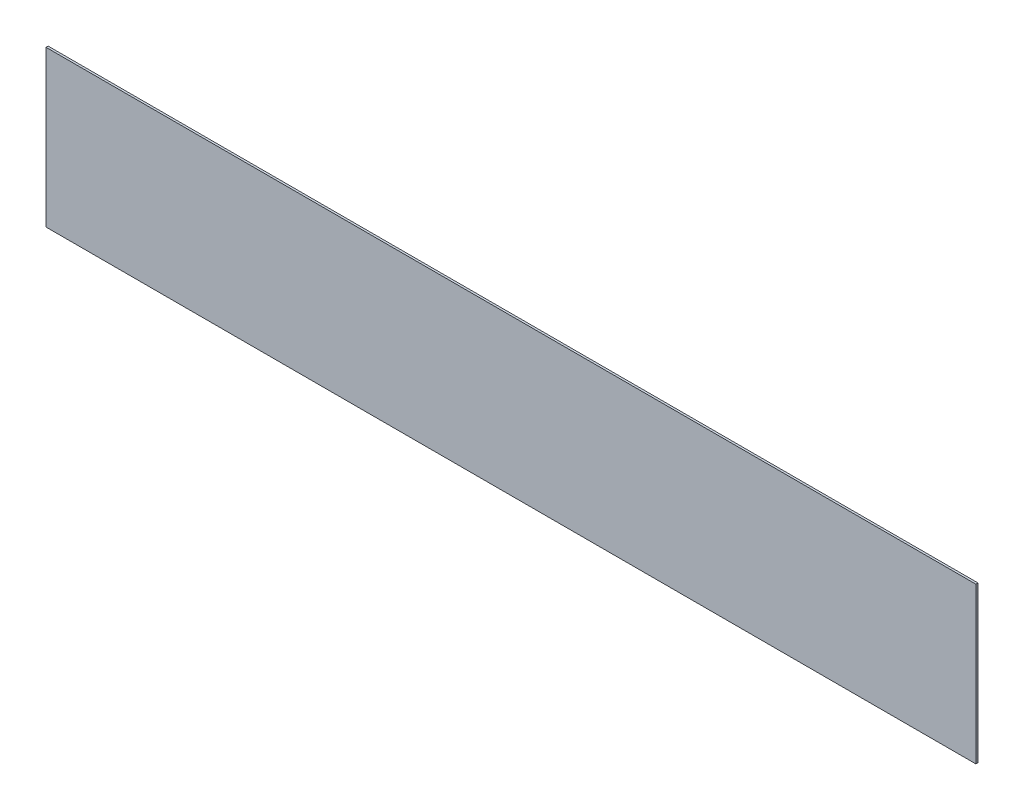
ISO-10303-21;
HEADER;
FILE_DESCRIPTION(('STEP AP214'),'2;1');
FILE_NAME('part.step','',(''),(''),'','','');
FILE_SCHEMA(('AUTOMOTIVE_DESIGN { 1 0 10303 214 1 1 1 1 }'));
ENDSEC;
DATA;
#1=APPLICATION_CONTEXT('core data for automotive mechanical design processes');
#2=APPLICATION_PROTOCOL_DEFINITION('international standard','automotive_design',2000,#1);
#3=PRODUCT_CONTEXT('',#1,'mechanical');
#4=PRODUCT('Part','Part','',(#3));
#5=PRODUCT_RELATED_PRODUCT_CATEGORY('part','',(#4));
#6=PRODUCT_DEFINITION_FORMATION('','',#4);
#7=PRODUCT_DEFINITION_CONTEXT('part definition',#1,'design');
#8=PRODUCT_DEFINITION('design','',#6,#7);
#9=PRODUCT_DEFINITION_SHAPE('','',#8);
#10=(LENGTH_UNIT() NAMED_UNIT(*) SI_UNIT(.MILLI.,.METRE.));
#11=(NAMED_UNIT(*) PLANE_ANGLE_UNIT() SI_UNIT($,.RADIAN.));
#12=(NAMED_UNIT(*) SI_UNIT($,.STERADIAN.) SOLID_ANGLE_UNIT());
#13=UNCERTAINTY_MEASURE_WITH_UNIT(LENGTH_MEASURE(1.E-05),#10,'distance_accuracy_value','');
#14=(GEOMETRIC_REPRESENTATION_CONTEXT(3) GLOBAL_UNCERTAINTY_ASSIGNED_CONTEXT((#13)) GLOBAL_UNIT_ASSIGNED_CONTEXT((#10,
#11,#12)) REPRESENTATION_CONTEXT('',''));
#15=CARTESIAN_POINT('',(0.,0.,0.));
#16=DIRECTION('',(0.,0.,1.));
#17=DIRECTION('',(1.,0.,0.));
#18=AXIS2_PLACEMENT_3D('',#15,#16,#17);
#19=CARTESIAN_POINT('',(21.5,10.,-800.));
#20=DIRECTION('',(-1.,0.,0.));
#21=DIRECTION('',(0.,0.,1.));
#22=AXIS2_PLACEMENT_3D('',#19,#20,#21);
#23=PLANE('',#22);
#24=DIRECTION('',(0.,-1.,0.));
#25=VECTOR('',#24,1.);
#26=CARTESIAN_POINT('',(21.5,10.,-798.5));
#27=LINE('',#26,#25);
#28=CARTESIAN_POINT('',(21.5,120.,-798.5));
#29=VERTEX_POINT('',#28);
#30=CARTESIAN_POINT('',(21.5,10.,-798.5));
#31=VERTEX_POINT('',#30);
#32=EDGE_CURVE('E103',#29,#31,#27,.T.);
#33=ORIENTED_EDGE('',*,*,#32,.F.);
#34=DIRECTION('',(0.,0.,1.));
#35=VECTOR('',#34,1.);
#36=CARTESIAN_POINT('',(21.5,120.,-800.));
#37=LINE('',#36,#35);
#38=CARTESIAN_POINT('',(21.5,120.,-800.));
#39=VERTEX_POINT('',#38);
#40=EDGE_CURVE('E11',#39,#29,#37,.T.);
#41=ORIENTED_EDGE('',*,*,#40,.F.);
#42=DIRECTION('',(0.,-1.,0.));
#43=VECTOR('',#42,1.);
#44=CARTESIAN_POINT('',(21.5,10.,-800.));
#45=LINE('',#44,#43);
#46=CARTESIAN_POINT('',(21.5,10.,-800.));
#47=VERTEX_POINT('',#46);
#48=EDGE_CURVE('E97',#39,#47,#45,.T.);
#49=ORIENTED_EDGE('',*,*,#48,.T.);
#50=DIRECTION('',(0.,0.,1.));
#51=VECTOR('',#50,1.);
#52=CARTESIAN_POINT('',(21.5,10.,-800.));
#53=LINE('',#52,#51);
#54=EDGE_CURVE('E42',#47,#31,#53,.T.);
#55=ORIENTED_EDGE('',*,*,#54,.T.);
#56=EDGE_LOOP('',(#33,#41,#49,#55));
#57=FACE_BOUND('',#56,.T.);
#58=ADVANCED_FACE('F39',(#57),#23,.T.);
#59=CARTESIAN_POINT('',(21.5,120.,-800.));
#60=DIRECTION('',(0.,1.,0.));
#61=DIRECTION('',(0.,0.,1.));
#62=AXIS2_PLACEMENT_3D('',#59,#60,#61);
#63=PLANE('',#62);
#64=DIRECTION('',(-1.,0.,0.));
#65=VECTOR('',#64,1.);
#66=CARTESIAN_POINT('',(21.5,120.,-798.5));
#67=LINE('',#66,#65);
#68=CARTESIAN_POINT('',(678.5,120.,-798.5));
#69=VERTEX_POINT('',#68);
#70=EDGE_CURVE('E99',#69,#29,#67,.T.);
#71=ORIENTED_EDGE('',*,*,#70,.F.);
#72=DIRECTION('',(0.,0.,1.));
#73=VECTOR('',#72,1.);
#74=CARTESIAN_POINT('',(678.5,120.,-800.));
#75=LINE('',#74,#73);
#76=CARTESIAN_POINT('',(678.5,120.,-800.));
#77=VERTEX_POINT('',#76);
#78=EDGE_CURVE('E48',#77,#69,#75,.T.);
#79=ORIENTED_EDGE('',*,*,#78,.F.);
#80=DIRECTION('',(-1.,0.,0.));
#81=VECTOR('',#80,1.);
#82=CARTESIAN_POINT('',(21.5,120.,-800.));
#83=LINE('',#82,#81);
#84=EDGE_CURVE('E94',#77,#39,#83,.T.);
#85=ORIENTED_EDGE('',*,*,#84,.T.);
#86=ORIENTED_EDGE('',*,*,#40,.T.);
#87=EDGE_LOOP('',(#71,#79,#85,#86));
#88=FACE_BOUND('',#87,.T.);
#89=ADVANCED_FACE('F113',(#88),#63,.T.);
#90=CARTESIAN_POINT('',(678.5,10.,-800.));
#91=DIRECTION('',(1.,0.,0.));
#92=DIRECTION('',(0.,0.,-1.));
#93=AXIS2_PLACEMENT_3D('',#90,#91,#92);
#94=PLANE('',#93);
#95=DIRECTION('',(0.,1.,0.));
#96=VECTOR('',#95,1.);
#97=CARTESIAN_POINT('',(678.5,10.,-798.5));
#98=LINE('',#97,#96);
#99=CARTESIAN_POINT('',(678.5,10.,-798.5));
#100=VERTEX_POINT('',#99);
#101=EDGE_CURVE('E89',#100,#69,#98,.T.);
#102=ORIENTED_EDGE('',*,*,#101,.F.);
#103=DIRECTION('',(0.,0.,1.));
#104=VECTOR('',#103,1.);
#105=CARTESIAN_POINT('',(678.5,10.,-800.));
#106=LINE('',#105,#104);
#107=CARTESIAN_POINT('',(678.5,10.,-800.));
#108=VERTEX_POINT('',#107);
#109=EDGE_CURVE('E84',#108,#100,#106,.T.);
#110=ORIENTED_EDGE('',*,*,#109,.F.);
#111=DIRECTION('',(0.,1.,0.));
#112=VECTOR('',#111,1.);
#113=CARTESIAN_POINT('',(678.5,10.,-800.));
#114=LINE('',#113,#112);
#115=EDGE_CURVE('E87',#108,#77,#114,.T.);
#116=ORIENTED_EDGE('',*,*,#115,.T.);
#117=ORIENTED_EDGE('',*,*,#78,.T.);
#118=EDGE_LOOP('',(#102,#110,#116,#117));
#119=FACE_BOUND('',#118,.T.);
#120=ADVANCED_FACE('F86',(#119),#94,.T.);
#121=CARTESIAN_POINT('',(21.5,10.,-800.));
#122=DIRECTION('',(0.,-1.,0.));
#123=DIRECTION('',(0.,0.,-1.));
#124=AXIS2_PLACEMENT_3D('',#121,#122,#123);
#125=PLANE('',#124);
#126=DIRECTION('',(1.,0.,0.));
#127=VECTOR('',#126,1.);
#128=CARTESIAN_POINT('',(21.5,10.,-798.5));
#129=LINE('',#128,#127);
#130=EDGE_CURVE('E106',#31,#100,#129,.T.);
#131=ORIENTED_EDGE('',*,*,#130,.F.);
#132=ORIENTED_EDGE('',*,*,#54,.F.);
#133=DIRECTION('',(1.,0.,0.));
#134=VECTOR('',#133,1.);
#135=CARTESIAN_POINT('',(21.5,10.,-800.));
#136=LINE('',#135,#134);
#137=EDGE_CURVE('E93',#47,#108,#136,.T.);
#138=ORIENTED_EDGE('',*,*,#137,.T.);
#139=ORIENTED_EDGE('',*,*,#109,.T.);
#140=EDGE_LOOP('',(#131,#132,#138,#139));
#141=FACE_BOUND('',#140,.T.);
#142=ADVANCED_FACE('F96',(#141),#125,.T.);
#143=CARTESIAN_POINT('',(0.,0.,-800.));
#144=DIRECTION('',(0.,0.,-1.));
#145=DIRECTION('',(-1.,0.,0.));
#146=AXIS2_PLACEMENT_3D('',#143,#144,#145);
#147=PLANE('',#146);
#148=ORIENTED_EDGE('',*,*,#48,.F.);
#149=ORIENTED_EDGE('',*,*,#84,.F.);
#150=ORIENTED_EDGE('',*,*,#115,.F.);
#151=ORIENTED_EDGE('',*,*,#137,.F.);
#152=EDGE_LOOP('',(#148,#149,#150,#151));
#153=FACE_BOUND('',#152,.T.);
#154=ADVANCED_FACE('F92',(#153),#147,.T.);
#155=CARTESIAN_POINT('',(0.,0.,-798.5));
#156=DIRECTION('',(0.,0.,-1.));
#157=DIRECTION('',(-1.,0.,0.));
#158=AXIS2_PLACEMENT_3D('',#155,#156,#157);
#159=PLANE('',#158);
#160=ORIENTED_EDGE('',*,*,#32,.T.);
#161=ORIENTED_EDGE('',*,*,#130,.T.);
#162=ORIENTED_EDGE('',*,*,#101,.T.);
#163=ORIENTED_EDGE('',*,*,#70,.T.);
#164=EDGE_LOOP('',(#160,#161,#162,#163));
#165=FACE_BOUND('',#164,.T.);
#166=ADVANCED_FACE('F112',(#165),#159,.F.);
#167=CLOSED_SHELL('',(#58,#89,#120,#142,#154,#166));
#168=MANIFOLD_SOLID_BREP('B2',#167);
#169=ADVANCED_BREP_SHAPE_REPRESENTATION('',(#18,#168),#14);
#170=SHAPE_DEFINITION_REPRESENTATION(#9,#169);
ENDSEC;
END-ISO-10303-21;
